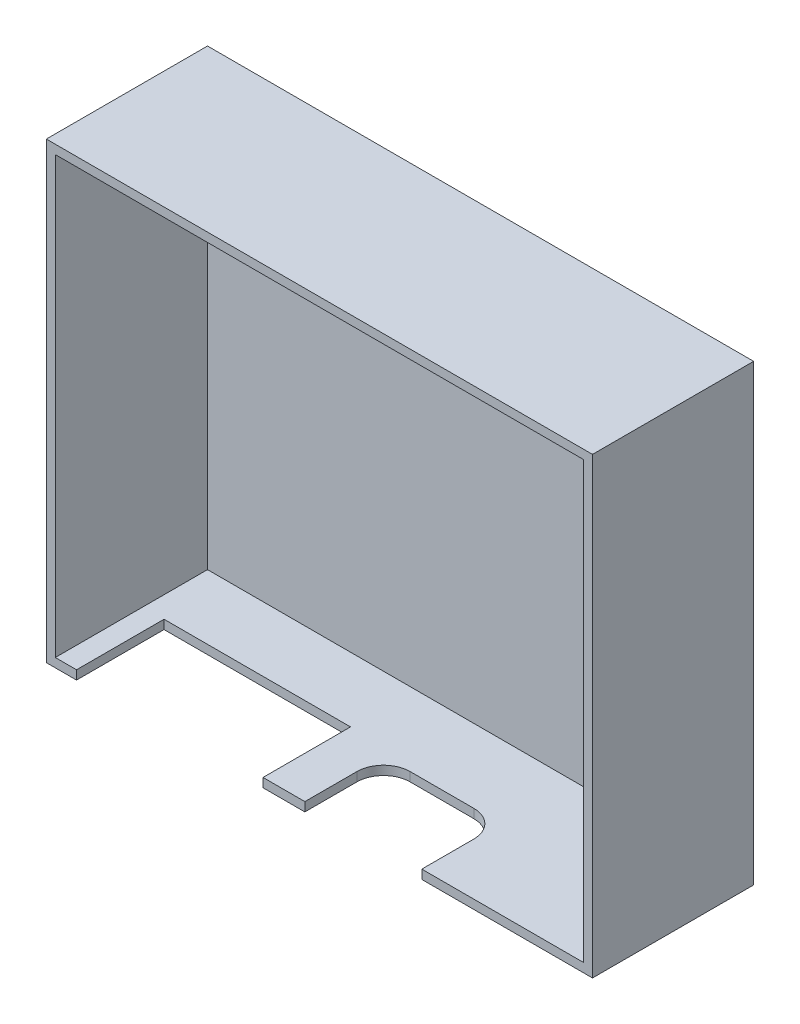
ISO-10303-21;
HEADER;
FILE_DESCRIPTION(('STEP AP214'),'2;1');
FILE_NAME('part.step','',(''),(''),'','','');
FILE_SCHEMA(('AUTOMOTIVE_DESIGN { 1 0 10303 214 1 1 1 1 }'));
ENDSEC;
DATA;
#1=APPLICATION_CONTEXT('core data for automotive mechanical design processes');
#2=APPLICATION_PROTOCOL_DEFINITION('international standard','automotive_design',2000,#1);
#3=PRODUCT_CONTEXT('',#1,'mechanical');
#4=PRODUCT('Part','Part','',(#3));
#5=PRODUCT_RELATED_PRODUCT_CATEGORY('part','',(#4));
#6=PRODUCT_DEFINITION_FORMATION('','',#4);
#7=PRODUCT_DEFINITION_CONTEXT('part definition',#1,'design');
#8=PRODUCT_DEFINITION('design','',#6,#7);
#9=PRODUCT_DEFINITION_SHAPE('','',#8);
#10=(LENGTH_UNIT() NAMED_UNIT(*) SI_UNIT(.MILLI.,.METRE.));
#11=(NAMED_UNIT(*) PLANE_ANGLE_UNIT() SI_UNIT($,.RADIAN.));
#12=(NAMED_UNIT(*) SI_UNIT($,.STERADIAN.) SOLID_ANGLE_UNIT());
#13=UNCERTAINTY_MEASURE_WITH_UNIT(LENGTH_MEASURE(1.E-05),#10,'distance_accuracy_value','');
#14=(GEOMETRIC_REPRESENTATION_CONTEXT(3) GLOBAL_UNCERTAINTY_ASSIGNED_CONTEXT((#13)) GLOBAL_UNIT_ASSIGNED_CONTEXT((#10,
#11,#12)) REPRESENTATION_CONTEXT('',''));
#15=CARTESIAN_POINT('',(0.,0.,0.));
#16=DIRECTION('',(0.,0.,1.));
#17=DIRECTION('',(1.,0.,0.));
#18=AXIS2_PLACEMENT_3D('',#15,#16,#17);
#19=CARTESIAN_POINT('',(146.414546847035,-130.8,6.385));
#20=DIRECTION('',(0.,-1.,0.));
#21=DIRECTION('',(0.,0.,-1.));
#22=AXIS2_PLACEMENT_3D('',#19,#20,#21);
#23=CYLINDRICAL_SURFACE('',#22,5.9535197921349);
#24=DIRECTION('',(0.,-1.,0.));
#25=VECTOR('',#24,1.);
#26=CARTESIAN_POINT('',(146.414546847035,-127.8,0.431480207865096));
#27=LINE('',#26,#25);
#28=CARTESIAN_POINT('',(146.414546847035,-130.8,0.431480207865096));
#29=VERTEX_POINT('',#28);
#30=CARTESIAN_POINT('',(146.414546847035,-132.8,0.431480207865096));
#31=VERTEX_POINT('',#30);
#32=EDGE_CURVE('E186',#29,#31,#27,.T.);
#33=ORIENTED_EDGE('',*,*,#32,.T.);
#34=CARTESIAN_POINT('',(146.414546847035,-132.8,6.385));
#35=DIRECTION('',(0.,-1.,0.));
#36=DIRECTION('',(0.,0.,-1.));
#37=AXIS2_PLACEMENT_3D('',#34,#35,#36);
#38=CIRCLE('',#37,5.9535197921349);
#39=CARTESIAN_POINT('',(152.36806663917,-132.8,6.385));
#40=VERTEX_POINT('',#39);
#41=EDGE_CURVE('E184',#31,#40,#38,.T.);
#42=ORIENTED_EDGE('',*,*,#41,.T.);
#43=DIRECTION('',(0.,-1.,0.));
#44=VECTOR('',#43,1.);
#45=CARTESIAN_POINT('',(152.36806663917,-130.8,6.385));
#46=LINE('',#45,#44);
#47=CARTESIAN_POINT('',(152.36806663917,-130.8,6.385));
#48=VERTEX_POINT('',#47);
#49=EDGE_CURVE('E295',#40,#48,#46,.F.);
#50=ORIENTED_EDGE('',*,*,#49,.T.);
#51=CARTESIAN_POINT('',(146.414546847035,-130.8,6.385));
#52=DIRECTION('',(0.,-1.,0.));
#53=DIRECTION('',(0.,0.,-1.));
#54=AXIS2_PLACEMENT_3D('',#51,#52,#53);
#55=CIRCLE('',#54,5.9535197921349);
#56=EDGE_CURVE('E197',#29,#48,#55,.T.);
#57=ORIENTED_EDGE('',*,*,#56,.F.);
#58=EDGE_LOOP('',(#33,#42,#50,#57));
#59=FACE_BOUND('',#58,.T.);
#60=ADVANCED_FACE('F42',(#59),#23,.F.);
#61=CARTESIAN_POINT('',(0.,0.,18.));
#62=DIRECTION('',(0.,0.,1.));
#63=DIRECTION('',(1.,0.,0.));
#64=AXIS2_PLACEMENT_3D('',#61,#62,#63);
#65=PLANE('',#64);
#66=DIRECTION('',(0.,-1.,0.));
#67=VECTOR('',#66,1.);
#68=CARTESIAN_POINT('',(126.246480207865,-127.8,18.));
#69=LINE('',#68,#67);
#70=CARTESIAN_POINT('',(126.246480207865,-130.8,18.));
#71=VERTEX_POINT('',#70);
#72=CARTESIAN_POINT('',(126.246480207865,-132.8,18.));
#73=VERTEX_POINT('',#72);
#74=EDGE_CURVE('E404',#71,#73,#69,.T.);
#75=ORIENTED_EDGE('',*,*,#74,.F.);
#76=DIRECTION('',(1.,0.,0.));
#77=VECTOR('',#76,1.);
#78=CARTESIAN_POINT('',(70.5,-130.8,18.));
#79=LINE('',#78,#77);
#80=CARTESIAN_POINT('',(116.899897304864,-130.8,18.));
#81=VERTEX_POINT('',#80);
#82=EDGE_CURVE('E233',#81,#71,#79,.T.);
#83=ORIENTED_EDGE('',*,*,#82,.F.);
#84=DIRECTION('',(0.,-1.,0.));
#85=VECTOR('',#84,1.);
#86=CARTESIAN_POINT('',(116.899897304864,-130.8,18.));
#87=LINE('',#86,#85);
#88=CARTESIAN_POINT('',(116.899897304864,-132.8,18.));
#89=VERTEX_POINT('',#88);
#90=EDGE_CURVE('E406',#81,#89,#87,.T.);
#91=ORIENTED_EDGE('',*,*,#90,.T.);
#92=DIRECTION('',(1.,0.,0.));
#93=VECTOR('',#92,1.);
#94=CARTESIAN_POINT('',(68.5,-132.8,18.));
#95=LINE('',#94,#93);
#96=EDGE_CURVE('E262',#89,#73,#95,.T.);
#97=ORIENTED_EDGE('',*,*,#96,.T.);
#98=EDGE_LOOP('',(#75,#83,#91,#97));
#99=FACE_BOUND('',#98,.T.);
#100=ADVANCED_FACE('F327',(#99),#65,.T.);
#101=CARTESIAN_POINT('',(68.5,-31.5,18.));
#102=DIRECTION('',(1.,0.,0.));
#103=DIRECTION('',(0.,1.,0.));
#104=AXIS2_PLACEMENT_3D('',#101,#102,#103);
#105=PLANE('',#104);
#106=DIRECTION('',(0.,-1.,0.));
#107=VECTOR('',#106,1.);
#108=CARTESIAN_POINT('',(68.5,-31.5,-18.));
#109=LINE('',#108,#107);
#110=CARTESIAN_POINT('',(68.5,-31.5,-18.));
#111=VERTEX_POINT('',#110);
#112=CARTESIAN_POINT('',(68.5,-132.8,-18.));
#113=VERTEX_POINT('',#112);
#114=EDGE_CURVE('E240',#111,#113,#109,.T.);
#115=ORIENTED_EDGE('',*,*,#114,.T.);
#116=DIRECTION('',(0.,0.,-1.));
#117=VECTOR('',#116,1.);
#118=CARTESIAN_POINT('',(68.5,-132.8,18.));
#119=LINE('',#118,#117);
#120=CARTESIAN_POINT('',(68.5,-132.8,18.));
#121=VERTEX_POINT('',#120);
#122=EDGE_CURVE('E291',#121,#113,#119,.T.);
#123=ORIENTED_EDGE('',*,*,#122,.F.);
#124=DIRECTION('',(0.,-1.,0.));
#125=VECTOR('',#124,1.);
#126=CARTESIAN_POINT('',(68.5,-31.5,18.));
#127=LINE('',#126,#125);
#128=CARTESIAN_POINT('',(68.5,-31.5,18.));
#129=VERTEX_POINT('',#128);
#130=EDGE_CURVE('E251',#129,#121,#127,.T.);
#131=ORIENTED_EDGE('',*,*,#130,.F.);
#132=DIRECTION('',(0.,0.,-1.));
#133=VECTOR('',#132,1.);
#134=CARTESIAN_POINT('',(68.5,-31.5,18.));
#135=LINE('',#134,#133);
#136=EDGE_CURVE('E268',#129,#111,#135,.T.);
#137=ORIENTED_EDGE('',*,*,#136,.T.);
#138=EDGE_LOOP('',(#115,#123,#131,#137));
#139=FACE_BOUND('',#138,.T.);
#140=ADVANCED_FACE('F44',(#139),#105,.F.);
#141=CARTESIAN_POINT('',(68.5,-132.8,18.));
#142=DIRECTION('',(0.,1.,0.));
#143=DIRECTION('',(0.,0.,1.));
#144=AXIS2_PLACEMENT_3D('',#141,#142,#143);
#145=PLANE('',#144);
#146=ORIENTED_EDGE('',*,*,#41,.F.);
#147=DIRECTION('',(1.,0.,0.));
#148=VECTOR('',#147,1.);
#149=CARTESIAN_POINT('',(146.414546847035,-132.8,0.431480207865096));
#150=LINE('',#149,#148);
#151=CARTESIAN_POINT('',(132.2,-132.8,0.431480207865096));
#152=VERTEX_POINT('',#151);
#153=EDGE_CURVE('E168',#152,#31,#150,.T.);
#154=ORIENTED_EDGE('',*,*,#153,.F.);
#155=CARTESIAN_POINT('',(132.2,-132.8,6.385));
#156=DIRECTION('',(0.,-1.,0.));
#157=DIRECTION('',(0.,0.,-1.));
#158=AXIS2_PLACEMENT_3D('',#155,#156,#157);
#159=CIRCLE('',#158,5.9535197921349);
#160=CARTESIAN_POINT('',(126.246480207865,-132.8,6.385));
#161=VERTEX_POINT('',#160);
#162=EDGE_CURVE('E182',#161,#152,#159,.T.);
#163=ORIENTED_EDGE('',*,*,#162,.F.);
#164=DIRECTION('',(0.,0.,-1.));
#165=VECTOR('',#164,1.);
#166=CARTESIAN_POINT('',(126.246480207865,-132.8,6.385));
#167=LINE('',#166,#165);
#168=EDGE_CURVE('E66',#73,#161,#167,.T.);
#169=ORIENTED_EDGE('',*,*,#168,.F.);
#170=ORIENTED_EDGE('',*,*,#96,.F.);
#171=DIRECTION('',(0.,0.,1.));
#172=VECTOR('',#171,1.);
#173=CARTESIAN_POINT('',(116.899897304864,-132.8,18.));
#174=LINE('',#173,#172);
#175=CARTESIAN_POINT('',(116.899897304864,-132.8,-1.55077897249618));
#176=VERTEX_POINT('',#175);
#177=EDGE_CURVE('E408',#176,#89,#174,.T.);
#178=ORIENTED_EDGE('',*,*,#177,.F.);
#179=DIRECTION('',(1.,0.,0.));
#180=VECTOR('',#179,1.);
#181=CARTESIAN_POINT('',(75.2413435068015,-132.8,-1.55077897249619));
#182=LINE('',#181,#180);
#183=CARTESIAN_POINT('',(75.2413435068015,-132.8,-1.55077897249619));
#184=VERTEX_POINT('',#183);
#185=EDGE_CURVE('E448',#184,#176,#182,.T.);
#186=ORIENTED_EDGE('',*,*,#185,.F.);
#187=DIRECTION('',(0.,0.,-1.));
#188=VECTOR('',#187,1.);
#189=CARTESIAN_POINT('',(75.2413435068015,-132.8,18.));
#190=LINE('',#189,#188);
#191=CARTESIAN_POINT('',(75.2413435068015,-132.8,18.));
#192=VERTEX_POINT('',#191);
#193=EDGE_CURVE('E389',#192,#184,#190,.T.);
#194=ORIENTED_EDGE('',*,*,#193,.F.);
#195=EDGE_CURVE('E257',#121,#192,#95,.T.);
#196=ORIENTED_EDGE('',*,*,#195,.F.);
#197=ORIENTED_EDGE('',*,*,#122,.T.);
#198=DIRECTION('',(1.,0.,0.));
#199=VECTOR('',#198,1.);
#200=CARTESIAN_POINT('',(68.5,-132.8,-18.));
#201=LINE('',#200,#199);
#202=CARTESIAN_POINT('',(190.5,-132.8,-18.));
#203=VERTEX_POINT('',#202);
#204=EDGE_CURVE('E272',#113,#203,#201,.T.);
#205=ORIENTED_EDGE('',*,*,#204,.T.);
#206=DIRECTION('',(0.,0.,-1.));
#207=VECTOR('',#206,1.);
#208=CARTESIAN_POINT('',(190.5,-132.8,18.));
#209=LINE('',#208,#207);
#210=CARTESIAN_POINT('',(190.5,-132.8,18.));
#211=VERTEX_POINT('',#210);
#212=EDGE_CURVE('E287',#211,#203,#209,.T.);
#213=ORIENTED_EDGE('',*,*,#212,.F.);
#214=CARTESIAN_POINT('',(152.36806663917,-132.8,18.));
#215=VERTEX_POINT('',#214);
#216=EDGE_CURVE('E255',#215,#211,#95,.T.);
#217=ORIENTED_EDGE('',*,*,#216,.F.);
#218=DIRECTION('',(0.,0.,1.));
#219=VECTOR('',#218,1.);
#220=CARTESIAN_POINT('',(152.36806663917,-132.8,18.));
#221=LINE('',#220,#219);
#222=EDGE_CURVE('E396',#40,#215,#221,.T.);
#223=ORIENTED_EDGE('',*,*,#222,.F.);
#224=EDGE_LOOP('',(#146,#154,#163,#169,#170,#178,#186,#194,#196,#197,#205,#213,#217,#223));
#225=FACE_BOUND('',#224,.T.);
#226=ADVANCED_FACE('F181',(#225),#145,.F.);
#227=CARTESIAN_POINT('',(190.5,-31.5,18.));
#228=DIRECTION('',(-1.,0.,0.));
#229=DIRECTION('',(0.,0.,1.));
#230=AXIS2_PLACEMENT_3D('',#227,#228,#229);
#231=PLANE('',#230);
#232=DIRECTION('',(0.,1.,0.));
#233=VECTOR('',#232,1.);
#234=CARTESIAN_POINT('',(190.5,-31.5,-18.));
#235=LINE('',#234,#233);
#236=CARTESIAN_POINT('',(190.5,-31.5,-18.));
#237=VERTEX_POINT('',#236);
#238=EDGE_CURVE('E275',#203,#237,#235,.T.);
#239=ORIENTED_EDGE('',*,*,#238,.T.);
#240=DIRECTION('',(0.,0.,-1.));
#241=VECTOR('',#240,1.);
#242=CARTESIAN_POINT('',(190.5,-31.5,18.));
#243=LINE('',#242,#241);
#244=CARTESIAN_POINT('',(190.5,-31.5,18.));
#245=VERTEX_POINT('',#244);
#246=EDGE_CURVE('E283',#245,#237,#243,.T.);
#247=ORIENTED_EDGE('',*,*,#246,.F.);
#248=DIRECTION('',(0.,1.,0.));
#249=VECTOR('',#248,1.);
#250=CARTESIAN_POINT('',(190.5,-31.5,18.));
#251=LINE('',#250,#249);
#252=EDGE_CURVE('E261',#211,#245,#251,.T.);
#253=ORIENTED_EDGE('',*,*,#252,.F.);
#254=ORIENTED_EDGE('',*,*,#212,.T.);
#255=EDGE_LOOP('',(#239,#247,#253,#254));
#256=FACE_BOUND('',#255,.T.);
#257=ADVANCED_FACE('F368',(#256),#231,.F.);
#258=CARTESIAN_POINT('',(68.5,-31.5,18.));
#259=DIRECTION('',(0.,-1.,0.));
#260=DIRECTION('',(0.,0.,-1.));
#261=AXIS2_PLACEMENT_3D('',#258,#259,#260);
#262=PLANE('',#261);
#263=DIRECTION('',(-1.,0.,0.));
#264=VECTOR('',#263,1.);
#265=CARTESIAN_POINT('',(68.5,-31.5,-18.));
#266=LINE('',#265,#264);
#267=EDGE_CURVE('E256',#237,#111,#266,.T.);
#268=ORIENTED_EDGE('',*,*,#267,.T.);
#269=ORIENTED_EDGE('',*,*,#136,.F.);
#270=DIRECTION('',(-1.,0.,0.));
#271=VECTOR('',#270,1.);
#272=CARTESIAN_POINT('',(68.5,-31.5,18.));
#273=LINE('',#272,#271);
#274=EDGE_CURVE('E265',#245,#129,#273,.T.);
#275=ORIENTED_EDGE('',*,*,#274,.F.);
#276=ORIENTED_EDGE('',*,*,#246,.T.);
#277=EDGE_LOOP('',(#268,#269,#275,#276));
#278=FACE_BOUND('',#277,.T.);
#279=ADVANCED_FACE('F361',(#278),#262,.F.);
#280=DIRECTION('',(0.,-1.,0.));
#281=VECTOR('',#280,1.);
#282=CARTESIAN_POINT('',(152.36806663917,-127.8,18.));
#283=LINE('',#282,#281);
#284=CARTESIAN_POINT('',(152.36806663917,-130.8,18.));
#285=VERTEX_POINT('',#284);
#286=EDGE_CURVE('E426',#285,#215,#283,.T.);
#287=ORIENTED_EDGE('',*,*,#286,.T.);
#288=ORIENTED_EDGE('',*,*,#216,.T.);
#289=ORIENTED_EDGE('',*,*,#252,.T.);
#290=ORIENTED_EDGE('',*,*,#274,.T.);
#291=ORIENTED_EDGE('',*,*,#130,.T.);
#292=ORIENTED_EDGE('',*,*,#195,.T.);
#293=DIRECTION('',(0.,-1.,0.));
#294=VECTOR('',#293,1.);
#295=CARTESIAN_POINT('',(75.2413435068015,-130.8,18.));
#296=LINE('',#295,#294);
#297=CARTESIAN_POINT('',(75.2413435068015,-130.8,18.));
#298=VERTEX_POINT('',#297);
#299=EDGE_CURVE('E203',#298,#192,#296,.T.);
#300=ORIENTED_EDGE('',*,*,#299,.F.);
#301=CARTESIAN_POINT('',(70.5,-130.8,18.));
#302=VERTEX_POINT('',#301);
#303=EDGE_CURVE('E229',#302,#298,#79,.T.);
#304=ORIENTED_EDGE('',*,*,#303,.F.);
#305=DIRECTION('',(0.,-1.,0.));
#306=VECTOR('',#305,1.);
#307=CARTESIAN_POINT('',(70.5,-33.5,18.));
#308=LINE('',#307,#306);
#309=CARTESIAN_POINT('',(70.5,-33.5,18.));
#310=VERTEX_POINT('',#309);
#311=EDGE_CURVE('E224',#310,#302,#308,.T.);
#312=ORIENTED_EDGE('',*,*,#311,.F.);
#313=DIRECTION('',(-1.,0.,0.));
#314=VECTOR('',#313,1.);
#315=CARTESIAN_POINT('',(188.5,-33.5,18.));
#316=LINE('',#315,#314);
#317=CARTESIAN_POINT('',(188.5,-33.5,18.));
#318=VERTEX_POINT('',#317);
#319=EDGE_CURVE('E195',#318,#310,#316,.T.);
#320=ORIENTED_EDGE('',*,*,#319,.F.);
#321=DIRECTION('',(0.,1.,0.));
#322=VECTOR('',#321,1.);
#323=CARTESIAN_POINT('',(188.5,-130.8,18.));
#324=LINE('',#323,#322);
#325=CARTESIAN_POINT('',(188.5,-130.8,18.));
#326=VERTEX_POINT('',#325);
#327=EDGE_CURVE('E209',#326,#318,#324,.T.);
#328=ORIENTED_EDGE('',*,*,#327,.F.);
#329=EDGE_CURVE('E228',#285,#326,#79,.T.);
#330=ORIENTED_EDGE('',*,*,#329,.F.);
#331=EDGE_LOOP('',(#287,#288,#289,#290,#291,#292,#300,#304,#312,#320,#328,#330));
#332=FACE_BOUND('',#331,.T.);
#333=ADVANCED_FACE('F335',(#332),#65,.T.);
#334=CARTESIAN_POINT('',(0.,0.,-18.));
#335=DIRECTION('',(0.,0.,1.));
#336=DIRECTION('',(1.,0.,0.));
#337=AXIS2_PLACEMENT_3D('',#334,#335,#336);
#338=PLANE('',#337);
#339=ORIENTED_EDGE('',*,*,#114,.F.);
#340=ORIENTED_EDGE('',*,*,#267,.F.);
#341=ORIENTED_EDGE('',*,*,#238,.F.);
#342=ORIENTED_EDGE('',*,*,#204,.F.);
#343=EDGE_LOOP('',(#339,#340,#341,#342));
#344=FACE_BOUND('',#343,.T.);
#345=ADVANCED_FACE('F357',(#344),#338,.F.);
#346=CARTESIAN_POINT('',(188.5,-33.5,-16.));
#347=DIRECTION('',(0.,1.,0.));
#348=DIRECTION('',(0.,0.,1.));
#349=AXIS2_PLACEMENT_3D('',#346,#347,#348);
#350=PLANE('',#349);
#351=ORIENTED_EDGE('',*,*,#319,.T.);
#352=DIRECTION('',(0.,0.,1.));
#353=VECTOR('',#352,1.);
#354=CARTESIAN_POINT('',(70.5,-33.5,-16.));
#355=LINE('',#354,#353);
#356=CARTESIAN_POINT('',(70.5,-33.5,-16.));
#357=VERTEX_POINT('',#356);
#358=EDGE_CURVE('E221',#357,#310,#355,.T.);
#359=ORIENTED_EDGE('',*,*,#358,.F.);
#360=DIRECTION('',(-1.,0.,0.));
#361=VECTOR('',#360,1.);
#362=CARTESIAN_POINT('',(188.5,-33.5,-16.));
#363=LINE('',#362,#361);
#364=CARTESIAN_POINT('',(188.5,-33.5,-16.));
#365=VERTEX_POINT('',#364);
#366=EDGE_CURVE('E204',#365,#357,#363,.T.);
#367=ORIENTED_EDGE('',*,*,#366,.F.);
#368=DIRECTION('',(0.,0.,1.));
#369=VECTOR('',#368,1.);
#370=CARTESIAN_POINT('',(188.5,-33.5,-16.));
#371=LINE('',#370,#369);
#372=EDGE_CURVE('E237',#365,#318,#371,.T.);
#373=ORIENTED_EDGE('',*,*,#372,.T.);
#374=EDGE_LOOP('',(#351,#359,#367,#373));
#375=FACE_BOUND('',#374,.T.);
#376=ADVANCED_FACE('F348',(#375),#350,.F.);
#377=CARTESIAN_POINT('',(188.5,-130.8,-16.));
#378=DIRECTION('',(1.,0.,0.));
#379=DIRECTION('',(0.,0.,-1.));
#380=AXIS2_PLACEMENT_3D('',#377,#378,#379);
#381=PLANE('',#380);
#382=ORIENTED_EDGE('',*,*,#327,.T.);
#383=ORIENTED_EDGE('',*,*,#372,.F.);
#384=DIRECTION('',(0.,1.,0.));
#385=VECTOR('',#384,1.);
#386=CARTESIAN_POINT('',(188.5,-130.8,-16.));
#387=LINE('',#386,#385);
#388=CARTESIAN_POINT('',(188.5,-130.8,-16.));
#389=VERTEX_POINT('',#388);
#390=EDGE_CURVE('E217',#389,#365,#387,.T.);
#391=ORIENTED_EDGE('',*,*,#390,.F.);
#392=DIRECTION('',(0.,0.,1.));
#393=VECTOR('',#392,1.);
#394=CARTESIAN_POINT('',(188.5,-130.8,-16.));
#395=LINE('',#394,#393);
#396=EDGE_CURVE('E241',#389,#326,#395,.T.);
#397=ORIENTED_EDGE('',*,*,#396,.T.);
#398=EDGE_LOOP('',(#382,#383,#391,#397));
#399=FACE_BOUND('',#398,.T.);
#400=ADVANCED_FACE('F344',(#399),#381,.F.);
#401=CARTESIAN_POINT('',(70.5,-130.8,-16.));
#402=DIRECTION('',(0.,-1.,0.));
#403=DIRECTION('',(0.,0.,-1.));
#404=AXIS2_PLACEMENT_3D('',#401,#402,#403);
#405=PLANE('',#404);
#406=CARTESIAN_POINT('',(132.2,-130.8,6.385));
#407=DIRECTION('',(0.,-1.,0.));
#408=DIRECTION('',(0.,0.,-1.));
#409=AXIS2_PLACEMENT_3D('',#406,#407,#408);
#410=CIRCLE('',#409,5.9535197921349);
#411=CARTESIAN_POINT('',(126.246480207865,-130.8,6.385));
#412=VERTEX_POINT('',#411);
#413=CARTESIAN_POINT('',(132.2,-130.8,0.4314802078651));
#414=VERTEX_POINT('',#413);
#415=EDGE_CURVE('E191',#412,#414,#410,.T.);
#416=ORIENTED_EDGE('',*,*,#415,.T.);
#417=DIRECTION('',(1.,0.,0.));
#418=VECTOR('',#417,1.);
#419=CARTESIAN_POINT('',(70.5,-130.8,0.431480207865098));
#420=LINE('',#419,#418);
#421=EDGE_CURVE('E58',#414,#29,#420,.T.);
#422=ORIENTED_EDGE('',*,*,#421,.T.);
#423=ORIENTED_EDGE('',*,*,#56,.T.);
#424=DIRECTION('',(0.,0.,1.));
#425=VECTOR('',#424,1.);
#426=CARTESIAN_POINT('',(152.36806663917,-130.8,-16.));
#427=LINE('',#426,#425);
#428=EDGE_CURVE('E429',#48,#285,#427,.T.);
#429=ORIENTED_EDGE('',*,*,#428,.T.);
#430=ORIENTED_EDGE('',*,*,#329,.T.);
#431=ORIENTED_EDGE('',*,*,#396,.F.);
#432=DIRECTION('',(1.,0.,0.));
#433=VECTOR('',#432,1.);
#434=CARTESIAN_POINT('',(70.5,-130.8,-16.));
#435=LINE('',#434,#433);
#436=CARTESIAN_POINT('',(70.5,-130.8,-16.));
#437=VERTEX_POINT('',#436);
#438=EDGE_CURVE('E213',#437,#389,#435,.T.);
#439=ORIENTED_EDGE('',*,*,#438,.F.);
#440=DIRECTION('',(0.,0.,1.));
#441=VECTOR('',#440,1.);
#442=CARTESIAN_POINT('',(70.5,-130.8,-16.));
#443=LINE('',#442,#441);
#444=EDGE_CURVE('E245',#437,#302,#443,.T.);
#445=ORIENTED_EDGE('',*,*,#444,.T.);
#446=ORIENTED_EDGE('',*,*,#303,.T.);
#447=DIRECTION('',(0.,0.,-1.));
#448=VECTOR('',#447,1.);
#449=CARTESIAN_POINT('',(75.2413435068015,-130.8,18.));
#450=LINE('',#449,#448);
#451=CARTESIAN_POINT('',(75.2413435068015,-130.8,-1.55077897249619));
#452=VERTEX_POINT('',#451);
#453=EDGE_CURVE('E433',#298,#452,#450,.T.);
#454=ORIENTED_EDGE('',*,*,#453,.T.);
#455=DIRECTION('',(1.,0.,0.));
#456=VECTOR('',#455,1.);
#457=CARTESIAN_POINT('',(75.2413435068015,-130.8,-1.55077897249619));
#458=LINE('',#457,#456);
#459=CARTESIAN_POINT('',(116.899897304864,-130.8,-1.55077897249618));
#460=VERTEX_POINT('',#459);
#461=EDGE_CURVE('E437',#452,#460,#458,.T.);
#462=ORIENTED_EDGE('',*,*,#461,.T.);
#463=DIRECTION('',(0.,0.,1.));
#464=VECTOR('',#463,1.);
#465=CARTESIAN_POINT('',(116.899897304864,-130.8,18.));
#466=LINE('',#465,#464);
#467=EDGE_CURVE('E441',#460,#81,#466,.T.);
#468=ORIENTED_EDGE('',*,*,#467,.T.);
#469=ORIENTED_EDGE('',*,*,#82,.T.);
#470=DIRECTION('',(0.,0.,-1.));
#471=VECTOR('',#470,1.);
#472=CARTESIAN_POINT('',(126.246480207865,-130.8,-16.));
#473=LINE('',#472,#471);
#474=EDGE_CURVE('E414',#71,#412,#473,.T.);
#475=ORIENTED_EDGE('',*,*,#474,.T.);
#476=EDGE_LOOP('',(#416,#422,#423,#429,#430,#431,#439,#445,#446,#454,#462,#468,#469,#475));
#477=FACE_BOUND('',#476,.T.);
#478=ADVANCED_FACE('F347',(#477),#405,.F.);
#479=CARTESIAN_POINT('',(70.5,-33.5,-16.));
#480=DIRECTION('',(-1.,0.,0.));
#481=DIRECTION('',(0.,-1.,0.));
#482=AXIS2_PLACEMENT_3D('',#479,#480,#481);
#483=PLANE('',#482);
#484=ORIENTED_EDGE('',*,*,#311,.T.);
#485=ORIENTED_EDGE('',*,*,#444,.F.);
#486=DIRECTION('',(0.,-1.,0.));
#487=VECTOR('',#486,1.);
#488=CARTESIAN_POINT('',(70.5,-33.5,-16.));
#489=LINE('',#488,#487);
#490=EDGE_CURVE('E208',#357,#437,#489,.T.);
#491=ORIENTED_EDGE('',*,*,#490,.F.);
#492=ORIENTED_EDGE('',*,*,#358,.T.);
#493=EDGE_LOOP('',(#484,#485,#491,#492));
#494=FACE_BOUND('',#493,.T.);
#495=ADVANCED_FACE('F342',(#494),#483,.F.);
#496=CARTESIAN_POINT('',(0.,0.,-16.));
#497=DIRECTION('',(0.,0.,1.));
#498=DIRECTION('',(1.,0.,0.));
#499=AXIS2_PLACEMENT_3D('',#496,#497,#498);
#500=PLANE('',#499);
#501=CARTESIAN_POINT('',(180.9,-126.3,-16.));
#502=DIRECTION('',(0.,0.,1.));
#503=DIRECTION('',(1.,0.,0.));
#504=AXIS2_PLACEMENT_3D('',#501,#502,#503);
#505=CIRCLE('',#504,1.513275);
#506=CARTESIAN_POINT('',(182.413275,-126.3,-16.));
#507=VERTEX_POINT('',#506);
#508=EDGE_CURVE('E549',#507,#507,#505,.T.);
#509=ORIENTED_EDGE('',*,*,#508,.F.);
#510=EDGE_LOOP('',(#509));
#511=FACE_BOUND('',#510,.T.);
#512=CARTESIAN_POINT('',(166.43,-40.5,-16.));
#513=DIRECTION('',(0.,0.,1.));
#514=DIRECTION('',(1.,0.,0.));
#515=AXIS2_PLACEMENT_3D('',#512,#513,#514);
#516=CIRCLE('',#515,1.60000000000002);
#517=CARTESIAN_POINT('',(168.03,-40.5,-16.));
#518=VERTEX_POINT('',#517);
#519=EDGE_CURVE('E545',#518,#518,#516,.T.);
#520=ORIENTED_EDGE('',*,*,#519,.F.);
#521=EDGE_LOOP('',(#520));
#522=FACE_BOUND('',#521,.T.);
#523=CARTESIAN_POINT('',(91.5,-40.5,-16.));
#524=DIRECTION('',(0.,0.,1.));
#525=DIRECTION('',(1.,0.,0.));
#526=AXIS2_PLACEMENT_3D('',#523,#524,#525);
#527=CIRCLE('',#526,1.6);
#528=CARTESIAN_POINT('',(93.1,-40.5,-16.));
#529=VERTEX_POINT('',#528);
#530=EDGE_CURVE('E187',#529,#529,#527,.T.);
#531=ORIENTED_EDGE('',*,*,#530,.F.);
#532=EDGE_LOOP('',(#531));
#533=FACE_BOUND('',#532,.T.);
#534=ORIENTED_EDGE('',*,*,#366,.T.);
#535=ORIENTED_EDGE('',*,*,#490,.T.);
#536=ORIENTED_EDGE('',*,*,#438,.T.);
#537=ORIENTED_EDGE('',*,*,#390,.T.);
#538=EDGE_LOOP('',(#534,#535,#536,#537));
#539=FACE_BOUND('',#538,.T.);
#540=ADVANCED_FACE('F339',(#511,#522,#533,#539),#500,.T.);
#541=CARTESIAN_POINT('',(132.2,-130.8,6.385));
#542=DIRECTION('',(0.,-1.,0.));
#543=DIRECTION('',(0.,0.,-1.));
#544=AXIS2_PLACEMENT_3D('',#541,#542,#543);
#545=CYLINDRICAL_SURFACE('',#544,5.9535197921349);
#546=ORIENTED_EDGE('',*,*,#162,.T.);
#547=DIRECTION('',(0.,-1.,0.));
#548=VECTOR('',#547,1.);
#549=CARTESIAN_POINT('',(132.2,-130.8,0.4314802078651));
#550=LINE('',#549,#548);
#551=EDGE_CURVE('E165',#152,#414,#550,.F.);
#552=ORIENTED_EDGE('',*,*,#551,.T.);
#553=ORIENTED_EDGE('',*,*,#415,.F.);
#554=DIRECTION('',(0.,-1.,0.));
#555=VECTOR('',#554,1.);
#556=CARTESIAN_POINT('',(126.246480207865,-130.8,6.385));
#557=LINE('',#556,#555);
#558=EDGE_CURVE('E176',#412,#161,#557,.T.);
#559=ORIENTED_EDGE('',*,*,#558,.T.);
#560=EDGE_LOOP('',(#546,#552,#553,#559));
#561=FACE_BOUND('',#560,.T.);
#562=ADVANCED_FACE('F189',(#561),#545,.F.);
#563=CARTESIAN_POINT('',(75.2413435068015,-130.8,18.));
#564=DIRECTION('',(-1.,0.,0.));
#565=DIRECTION('',(0.,0.,1.));
#566=AXIS2_PLACEMENT_3D('',#563,#564,#565);
#567=PLANE('',#566);
#568=ORIENTED_EDGE('',*,*,#193,.T.);
#569=DIRECTION('',(0.,-1.,0.));
#570=VECTOR('',#569,1.);
#571=CARTESIAN_POINT('',(75.2413435068015,-130.8,-1.55077897249619));
#572=LINE('',#571,#570);
#573=EDGE_CURVE('E445',#452,#184,#572,.T.);
#574=ORIENTED_EDGE('',*,*,#573,.F.);
#575=ORIENTED_EDGE('',*,*,#453,.F.);
#576=ORIENTED_EDGE('',*,*,#299,.T.);
#577=EDGE_LOOP('',(#568,#574,#575,#576));
#578=FACE_BOUND('',#577,.T.);
#579=ADVANCED_FACE('F466',(#578),#567,.F.);
#580=CARTESIAN_POINT('',(116.899897304864,-130.8,18.));
#581=DIRECTION('',(1.,0.,0.));
#582=DIRECTION('',(0.,0.,-1.));
#583=AXIS2_PLACEMENT_3D('',#580,#581,#582);
#584=PLANE('',#583);
#585=ORIENTED_EDGE('',*,*,#177,.T.);
#586=ORIENTED_EDGE('',*,*,#90,.F.);
#587=ORIENTED_EDGE('',*,*,#467,.F.);
#588=DIRECTION('',(0.,-1.,0.));
#589=VECTOR('',#588,1.);
#590=CARTESIAN_POINT('',(116.899897304864,-130.8,-1.55077897249618));
#591=LINE('',#590,#589);
#592=EDGE_CURVE('E458',#460,#176,#591,.T.);
#593=ORIENTED_EDGE('',*,*,#592,.T.);
#594=EDGE_LOOP('',(#585,#586,#587,#593));
#595=FACE_BOUND('',#594,.T.);
#596=ADVANCED_FACE('F481',(#595),#584,.F.);
#597=CARTESIAN_POINT('',(75.2413435068015,-130.8,-1.55077897249619));
#598=DIRECTION('',(0.,0.,-1.));
#599=DIRECTION('',(-1.,0.,0.));
#600=AXIS2_PLACEMENT_3D('',#597,#598,#599);
#601=PLANE('',#600);
#602=ORIENTED_EDGE('',*,*,#185,.T.);
#603=ORIENTED_EDGE('',*,*,#592,.F.);
#604=ORIENTED_EDGE('',*,*,#461,.F.);
#605=ORIENTED_EDGE('',*,*,#573,.T.);
#606=EDGE_LOOP('',(#602,#603,#604,#605));
#607=FACE_BOUND('',#606,.T.);
#608=ADVANCED_FACE('F463',(#607),#601,.F.);
#609=CARTESIAN_POINT('',(152.36806663917,-127.8,18.));
#610=DIRECTION('',(1.,0.,0.));
#611=DIRECTION('',(0.,0.,-1.));
#612=AXIS2_PLACEMENT_3D('',#609,#610,#611);
#613=PLANE('',#612);
#614=ORIENTED_EDGE('',*,*,#49,.F.);
#615=ORIENTED_EDGE('',*,*,#222,.T.);
#616=ORIENTED_EDGE('',*,*,#286,.F.);
#617=ORIENTED_EDGE('',*,*,#428,.F.);
#618=EDGE_LOOP('',(#614,#615,#616,#617));
#619=FACE_BOUND('',#618,.T.);
#620=ADVANCED_FACE('F488',(#619),#613,.F.);
#621=CARTESIAN_POINT('',(126.246480207865,-127.8,6.385));
#622=DIRECTION('',(-1.,0.,0.));
#623=DIRECTION('',(0.,0.,1.));
#624=AXIS2_PLACEMENT_3D('',#621,#622,#623);
#625=PLANE('',#624);
#626=ORIENTED_EDGE('',*,*,#74,.T.);
#627=ORIENTED_EDGE('',*,*,#168,.T.);
#628=ORIENTED_EDGE('',*,*,#558,.F.);
#629=ORIENTED_EDGE('',*,*,#474,.F.);
#630=EDGE_LOOP('',(#626,#627,#628,#629));
#631=FACE_BOUND('',#630,.T.);
#632=ADVANCED_FACE('F493',(#631),#625,.F.);
#633=CARTESIAN_POINT('',(146.414546847035,-127.8,0.431480207865096));
#634=DIRECTION('',(0.,0.,-1.));
#635=DIRECTION('',(-1.,0.,0.));
#636=AXIS2_PLACEMENT_3D('',#633,#634,#635);
#637=PLANE('',#636);
#638=ORIENTED_EDGE('',*,*,#551,.F.);
#639=ORIENTED_EDGE('',*,*,#153,.T.);
#640=ORIENTED_EDGE('',*,*,#32,.F.);
#641=ORIENTED_EDGE('',*,*,#421,.F.);
#642=EDGE_LOOP('',(#638,#639,#640,#641));
#643=FACE_BOUND('',#642,.T.);
#644=ADVANCED_FACE('F167',(#643),#637,.F.);
#645=CARTESIAN_POINT('',(91.5,-40.5,-16.));
#646=DIRECTION('',(0.,0.,-1.));
#647=DIRECTION('',(1.,0.,0.));
#648=AXIS2_PLACEMENT_3D('',#645,#646,#647);
#649=CONICAL_SURFACE('',#648,1.6,0.349065850398867);
#650=ORIENTED_EDGE('',*,*,#530,.T.);
#651=EDGE_LOOP('',(#650));
#652=FACE_BOUND('',#651,.T.);
#653=CARTESIAN_POINT('',(91.5,-40.5,-15.0383829031909));
#654=DIRECTION('',(0.,0.,-1.));
#655=DIRECTION('',(-1.,0.,0.));
#656=AXIS2_PLACEMENT_3D('',#653,#654,#655);
#657=CIRCLE('',#656,1.25);
#658=CARTESIAN_POINT('',(90.25,-40.5,-15.0383829031909));
#659=VERTEX_POINT('',#658);
#660=EDGE_CURVE('E175',#659,#659,#657,.T.);
#661=ORIENTED_EDGE('',*,*,#660,.T.);
#662=EDGE_LOOP('',(#661));
#663=FACE_BOUND('',#662,.T.);
#664=ADVANCED_FACE('F502',(#652,#663),#649,.T.);
#665=CARTESIAN_POINT('',(91.5,-40.5,0.999999999999959));
#666=DIRECTION('',(0.,0.,1.));
#667=DIRECTION('',(1.,0.,0.));
#668=AXIS2_PLACEMENT_3D('',#665,#666,#667);
#669=PLANE('',#668);
#670=CARTESIAN_POINT('',(91.5,-40.5,0.999999999999959));
#671=DIRECTION('',(0.,0.,1.));
#672=DIRECTION('',(1.,0.,0.));
#673=AXIS2_PLACEMENT_3D('',#670,#671,#672);
#674=CIRCLE('',#673,1.25);
#675=CARTESIAN_POINT('',(92.75,-40.5,0.999999999999959));
#676=VERTEX_POINT('',#675);
#677=EDGE_CURVE('E410',#676,#676,#674,.T.);
#678=ORIENTED_EDGE('',*,*,#677,.T.);
#679=EDGE_LOOP('',(#678));
#680=FACE_BOUND('',#679,.T.);
#681=ADVANCED_FACE('F499',(#680),#669,.T.);
#682=CARTESIAN_POINT('',(91.5,-40.5,0.999999999999959));
#683=DIRECTION('',(0.,0.,-1.));
#684=DIRECTION('',(-1.,0.,0.));
#685=AXIS2_PLACEMENT_3D('',#682,#683,#684);
#686=CYLINDRICAL_SURFACE('',#685,1.25);
#687=ORIENTED_EDGE('',*,*,#677,.F.);
#688=EDGE_LOOP('',(#687));
#689=FACE_BOUND('',#688,.T.);
#690=ORIENTED_EDGE('',*,*,#660,.F.);
#691=EDGE_LOOP('',(#690));
#692=FACE_BOUND('',#691,.T.);
#693=ADVANCED_FACE('F497',(#689,#692),#686,.T.);
#694=CARTESIAN_POINT('',(166.43,-40.5,-16.));
#695=DIRECTION('',(0.,0.,-1.));
#696=DIRECTION('',(1.,0.,0.));
#697=AXIS2_PLACEMENT_3D('',#694,#695,#696);
#698=CONICAL_SURFACE('',#697,1.60000000000002,0.349065850398867);
#699=ORIENTED_EDGE('',*,*,#519,.T.);
#700=EDGE_LOOP('',(#699));
#701=FACE_BOUND('',#700,.T.);
#702=CARTESIAN_POINT('',(166.43,-40.5,-15.0383829031909));
#703=DIRECTION('',(0.,0.,-1.));
#704=DIRECTION('',(-1.,0.,0.));
#705=AXIS2_PLACEMENT_3D('',#702,#703,#704);
#706=CIRCLE('',#705,1.25000000000001);
#707=CARTESIAN_POINT('',(165.18,-40.5,-15.0383829031909));
#708=VERTEX_POINT('',#707);
#709=EDGE_CURVE('E51',#708,#708,#706,.T.);
#710=ORIENTED_EDGE('',*,*,#709,.T.);
#711=EDGE_LOOP('',(#710));
#712=FACE_BOUND('',#711,.T.);
#713=ADVANCED_FACE('F307',(#701,#712),#698,.T.);
#714=CARTESIAN_POINT('',(166.43,-40.5,0.999999999999959));
#715=DIRECTION('',(0.,0.,1.));
#716=DIRECTION('',(1.,0.,0.));
#717=AXIS2_PLACEMENT_3D('',#714,#715,#716);
#718=PLANE('',#717);
#719=CARTESIAN_POINT('',(166.43,-40.5,0.999999999999959));
#720=DIRECTION('',(0.,0.,1.));
#721=DIRECTION('',(1.,0.,0.));
#722=AXIS2_PLACEMENT_3D('',#719,#720,#721);
#723=CIRCLE('',#722,1.25000000000001);
#724=CARTESIAN_POINT('',(167.68,-40.5,0.999999999999959));
#725=VERTEX_POINT('',#724);
#726=EDGE_CURVE('E417',#725,#725,#723,.T.);
#727=ORIENTED_EDGE('',*,*,#726,.T.);
#728=EDGE_LOOP('',(#727));
#729=FACE_BOUND('',#728,.T.);
#730=ADVANCED_FACE('F312',(#729),#718,.T.);
#731=CARTESIAN_POINT('',(166.43,-40.5,0.999999999999959));
#732=DIRECTION('',(0.,0.,-1.));
#733=DIRECTION('',(-1.,0.,0.));
#734=AXIS2_PLACEMENT_3D('',#731,#732,#733);
#735=CYLINDRICAL_SURFACE('',#734,1.25000000000001);
#736=ORIENTED_EDGE('',*,*,#726,.F.);
#737=EDGE_LOOP('',(#736));
#738=FACE_BOUND('',#737,.T.);
#739=ORIENTED_EDGE('',*,*,#709,.F.);
#740=EDGE_LOOP('',(#739));
#741=FACE_BOUND('',#740,.T.);
#742=ADVANCED_FACE('F309',(#738,#741),#735,.T.);
#743=CARTESIAN_POINT('',(180.9,-126.3,-16.));
#744=DIRECTION('',(0.,0.,-1.));
#745=DIRECTION('',(1.,0.,0.));
#746=AXIS2_PLACEMENT_3D('',#743,#744,#745);
#747=CONICAL_SURFACE('',#746,1.513275,0.349065850398867);
#748=ORIENTED_EDGE('',*,*,#508,.T.);
#749=EDGE_LOOP('',(#748));
#750=FACE_BOUND('',#749,.T.);
#751=CARTESIAN_POINT('',(180.9,-126.3,-15.2766578823932));
#752=DIRECTION('',(0.,0.,-1.));
#753=DIRECTION('',(-1.,0.,0.));
#754=AXIS2_PLACEMENT_3D('',#751,#752,#753);
#755=CIRCLE('',#754,1.25000000000001);
#756=CARTESIAN_POINT('',(179.65,-126.3,-15.2766578823932));
#757=VERTEX_POINT('',#756);
#758=EDGE_CURVE('E11',#757,#757,#755,.T.);
#759=ORIENTED_EDGE('',*,*,#758,.T.);
#760=EDGE_LOOP('',(#759));
#761=FACE_BOUND('',#760,.T.);
#762=ADVANCED_FACE('F311',(#750,#761),#747,.T.);
#763=CARTESIAN_POINT('',(180.9,-126.3,0.999999999999959));
#764=DIRECTION('',(0.,0.,1.));
#765=DIRECTION('',(1.,0.,0.));
#766=AXIS2_PLACEMENT_3D('',#763,#764,#765);
#767=PLANE('',#766);
#768=CARTESIAN_POINT('',(180.9,-126.3,0.999999999999959));
#769=DIRECTION('',(0.,0.,1.));
#770=DIRECTION('',(1.,0.,0.));
#771=AXIS2_PLACEMENT_3D('',#768,#769,#770);
#772=CIRCLE('',#771,1.25000000000001);
#773=CARTESIAN_POINT('',(182.15,-126.3,0.999999999999959));
#774=VERTEX_POINT('',#773);
#775=EDGE_CURVE('E531',#774,#774,#772,.T.);
#776=ORIENTED_EDGE('',*,*,#775,.T.);
#777=EDGE_LOOP('',(#776));
#778=FACE_BOUND('',#777,.T.);
#779=ADVANCED_FACE('F319',(#778),#767,.T.);
#780=CARTESIAN_POINT('',(180.9,-126.3,0.999999999999959));
#781=DIRECTION('',(0.,0.,-1.));
#782=DIRECTION('',(-1.,0.,0.));
#783=AXIS2_PLACEMENT_3D('',#780,#781,#782);
#784=CYLINDRICAL_SURFACE('',#783,1.25000000000001);
#785=ORIENTED_EDGE('',*,*,#775,.F.);
#786=EDGE_LOOP('',(#785));
#787=FACE_BOUND('',#786,.T.);
#788=ORIENTED_EDGE('',*,*,#758,.F.);
#789=EDGE_LOOP('',(#788));
#790=FACE_BOUND('',#789,.T.);
#791=ADVANCED_FACE('F522',(#787,#790),#784,.T.);
#792=CLOSED_SHELL('',(#60,#100,#140,#226,#257,#279,#333,#345,#376,#400,#478,#495,#540,#562,#579,
#596,#608,#620,#632,#644,#664,#681,#693,#713,#730,#742,#762,#779,#791));
#793=MANIFOLD_SOLID_BREP('B2',#792);
#794=ADVANCED_BREP_SHAPE_REPRESENTATION('',(#18,#793),#14);
#795=SHAPE_DEFINITION_REPRESENTATION(#9,#794);
ENDSEC;
END-ISO-10303-21;
